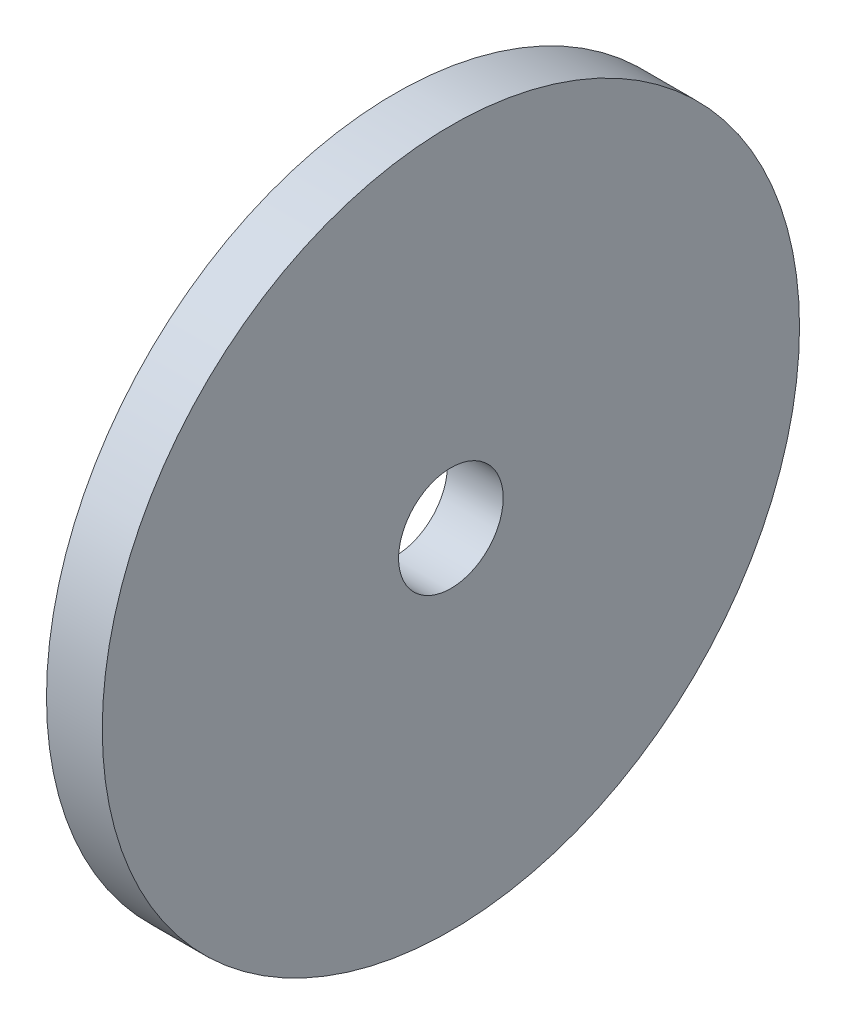
ISO-10303-21;
HEADER;
FILE_DESCRIPTION(('STEP AP214'),'2;1');
FILE_NAME('part.step','',(''),(''),'','','');
FILE_SCHEMA(('AUTOMOTIVE_DESIGN { 1 0 10303 214 1 1 1 1 }'));
ENDSEC;
DATA;
#1=APPLICATION_CONTEXT('core data for automotive mechanical design processes');
#2=APPLICATION_PROTOCOL_DEFINITION('international standard','automotive_design',2000,#1);
#3=PRODUCT_CONTEXT('',#1,'mechanical');
#4=PRODUCT('Part','Part','',(#3));
#5=PRODUCT_RELATED_PRODUCT_CATEGORY('part','',(#4));
#6=PRODUCT_DEFINITION_FORMATION('','',#4);
#7=PRODUCT_DEFINITION_CONTEXT('part definition',#1,'design');
#8=PRODUCT_DEFINITION('design','',#6,#7);
#9=PRODUCT_DEFINITION_SHAPE('','',#8);
#10=(LENGTH_UNIT() NAMED_UNIT(*) SI_UNIT(.MILLI.,.METRE.));
#11=(NAMED_UNIT(*) PLANE_ANGLE_UNIT() SI_UNIT($,.RADIAN.));
#12=(NAMED_UNIT(*) SI_UNIT($,.STERADIAN.) SOLID_ANGLE_UNIT());
#13=UNCERTAINTY_MEASURE_WITH_UNIT(LENGTH_MEASURE(1.E-05),#10,'distance_accuracy_value','');
#14=(GEOMETRIC_REPRESENTATION_CONTEXT(3) GLOBAL_UNCERTAINTY_ASSIGNED_CONTEXT((#13)) GLOBAL_UNIT_ASSIGNED_CONTEXT((#10,
#11,#12)) REPRESENTATION_CONTEXT('',''));
#15=CARTESIAN_POINT('',(0.,0.,0.));
#16=DIRECTION('',(0.,0.,1.));
#17=DIRECTION('',(1.,0.,0.));
#18=AXIS2_PLACEMENT_3D('',#15,#16,#17);
#19=CARTESIAN_POINT('',(2.8,0.,0.));
#20=DIRECTION('',(1.,0.,0.));
#21=DIRECTION('',(0.,0.,-1.));
#22=AXIS2_PLACEMENT_3D('',#19,#20,#21);
#23=PLANE('',#22);
#24=CARTESIAN_POINT('',(2.8,0.,0.));
#25=DIRECTION('',(1.,0.,0.));
#26=DIRECTION('',(0.,0.,-1.));
#27=AXIS2_PLACEMENT_3D('',#24,#25,#26);
#28=CIRCLE('',#27,17.5);
#29=CARTESIAN_POINT('',(2.8,0.,-17.5));
#30=VERTEX_POINT('',#29);
#31=EDGE_CURVE('E10',#30,#30,#28,.T.);
#32=ORIENTED_EDGE('',*,*,#31,.T.);
#33=EDGE_LOOP('',(#32));
#34=FACE_BOUND('',#33,.T.);
#35=CARTESIAN_POINT('',(2.8,0.,0.));
#36=DIRECTION('',(1.,0.,0.));
#37=DIRECTION('',(0.,0.,-1.));
#38=AXIS2_PLACEMENT_3D('',#35,#36,#37);
#39=CIRCLE('',#38,2.625);
#40=CARTESIAN_POINT('',(2.8,0.,-2.625));
#41=VERTEX_POINT('',#40);
#42=EDGE_CURVE('E41',#41,#41,#39,.T.);
#43=ORIENTED_EDGE('',*,*,#42,.F.);
#44=EDGE_LOOP('',(#43));
#45=FACE_BOUND('',#44,.T.);
#46=ADVANCED_FACE('F30',(#34,#45),#23,.T.);
#47=CARTESIAN_POINT('',(0.,0.,0.));
#48=DIRECTION('',(1.,0.,0.));
#49=DIRECTION('',(0.,0.,-1.));
#50=AXIS2_PLACEMENT_3D('',#47,#48,#49);
#51=PLANE('',#50);
#52=CARTESIAN_POINT('',(0.,0.,0.));
#53=DIRECTION('',(1.,0.,0.));
#54=DIRECTION('',(0.,0.,-1.));
#55=AXIS2_PLACEMENT_3D('',#52,#53,#54);
#56=CIRCLE('',#55,17.5);
#57=CARTESIAN_POINT('',(0.,0.,-17.5));
#58=VERTEX_POINT('',#57);
#59=EDGE_CURVE('E34',#58,#58,#56,.T.);
#60=ORIENTED_EDGE('',*,*,#59,.F.);
#61=EDGE_LOOP('',(#60));
#62=FACE_BOUND('',#61,.T.);
#63=CARTESIAN_POINT('',(0.,0.,0.));
#64=DIRECTION('',(1.,0.,0.));
#65=DIRECTION('',(0.,0.,-1.));
#66=AXIS2_PLACEMENT_3D('',#63,#64,#65);
#67=CIRCLE('',#66,2.625);
#68=CARTESIAN_POINT('',(0.,0.,-2.625));
#69=VERTEX_POINT('',#68);
#70=EDGE_CURVE('E43',#69,#69,#67,.T.);
#71=ORIENTED_EDGE('',*,*,#70,.T.);
#72=EDGE_LOOP('',(#71));
#73=FACE_BOUND('',#72,.T.);
#74=ADVANCED_FACE('F53',(#62,#73),#51,.F.);
#75=CARTESIAN_POINT('',(2.8,0.,0.));
#76=DIRECTION('',(-1.,0.,0.));
#77=DIRECTION('',(0.,0.,1.));
#78=AXIS2_PLACEMENT_3D('',#75,#76,#77);
#79=CYLINDRICAL_SURFACE('',#78,17.5);
#80=ORIENTED_EDGE('',*,*,#31,.F.);
#81=EDGE_LOOP('',(#80));
#82=FACE_BOUND('',#81,.T.);
#83=ORIENTED_EDGE('',*,*,#59,.T.);
#84=EDGE_LOOP('',(#83));
#85=FACE_BOUND('',#84,.T.);
#86=ADVANCED_FACE('F32',(#82,#85),#79,.T.);
#87=CARTESIAN_POINT('',(2.8,0.,0.));
#88=DIRECTION('',(-1.,0.,0.));
#89=DIRECTION('',(0.,0.,1.));
#90=AXIS2_PLACEMENT_3D('',#87,#88,#89);
#91=CYLINDRICAL_SURFACE('',#90,2.625);
#92=ORIENTED_EDGE('',*,*,#42,.T.);
#93=EDGE_LOOP('',(#92));
#94=FACE_BOUND('',#93,.T.);
#95=ORIENTED_EDGE('',*,*,#70,.F.);
#96=EDGE_LOOP('',(#95));
#97=FACE_BOUND('',#96,.T.);
#98=ADVANCED_FACE('F49',(#94,#97),#91,.F.);
#99=CLOSED_SHELL('',(#46,#74,#86,#98));
#100=MANIFOLD_SOLID_BREP('B2',#99);
#101=ADVANCED_BREP_SHAPE_REPRESENTATION('',(#18,#100),#14);
#102=SHAPE_DEFINITION_REPRESENTATION(#9,#101);
ENDSEC;
END-ISO-10303-21;
